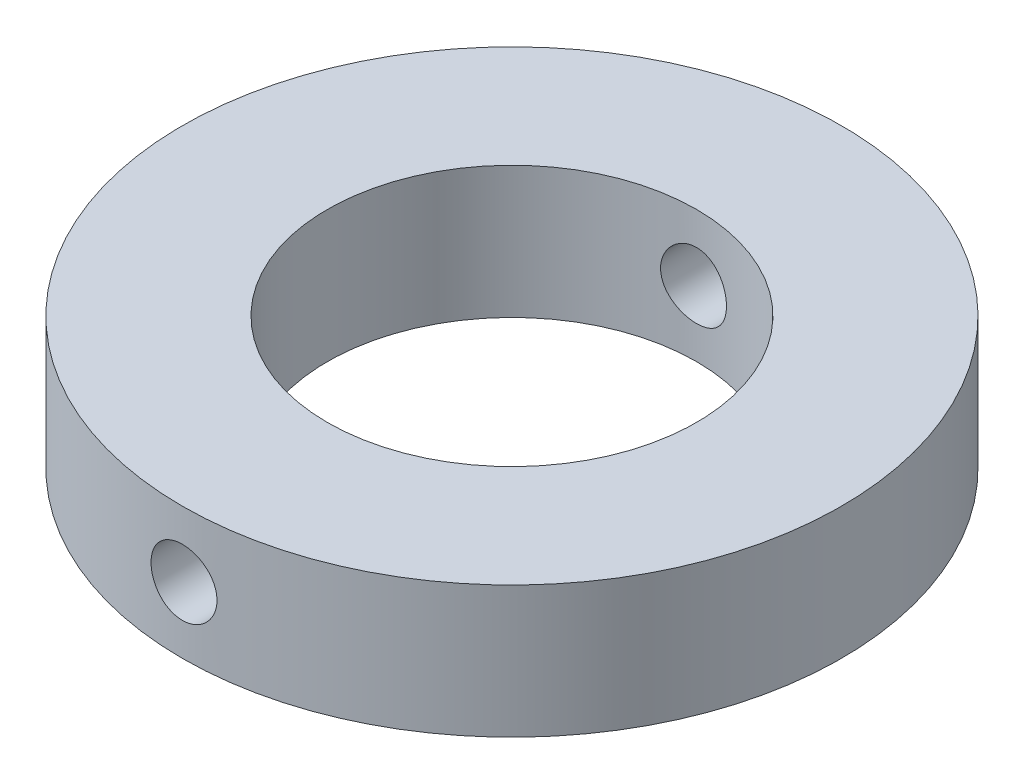
ISO-10303-21;
HEADER;
FILE_DESCRIPTION(('STEP AP214'),'2;1');
FILE_NAME('part.step','',(''),(''),'','','');
FILE_SCHEMA(('AUTOMOTIVE_DESIGN { 1 0 10303 214 1 1 1 1 }'));
ENDSEC;
DATA;
#1=APPLICATION_CONTEXT('core data for automotive mechanical design processes');
#2=APPLICATION_PROTOCOL_DEFINITION('international standard','automotive_design',2000,#1);
#3=PRODUCT_CONTEXT('',#1,'mechanical');
#4=PRODUCT('Part','Part','',(#3));
#5=PRODUCT_RELATED_PRODUCT_CATEGORY('part','',(#4));
#6=PRODUCT_DEFINITION_FORMATION('','',#4);
#7=PRODUCT_DEFINITION_CONTEXT('part definition',#1,'design');
#8=PRODUCT_DEFINITION('design','',#6,#7);
#9=PRODUCT_DEFINITION_SHAPE('','',#8);
#10=(LENGTH_UNIT() NAMED_UNIT(*) SI_UNIT(.MILLI.,.METRE.));
#11=(NAMED_UNIT(*) PLANE_ANGLE_UNIT() SI_UNIT($,.RADIAN.));
#12=(NAMED_UNIT(*) SI_UNIT($,.STERADIAN.) SOLID_ANGLE_UNIT());
#13=UNCERTAINTY_MEASURE_WITH_UNIT(LENGTH_MEASURE(1.E-05),#10,'distance_accuracy_value','');
#14=(GEOMETRIC_REPRESENTATION_CONTEXT(3) GLOBAL_UNCERTAINTY_ASSIGNED_CONTEXT((#13)) GLOBAL_UNIT_ASSIGNED_CONTEXT((#10,
#11,#12)) REPRESENTATION_CONTEXT('',''));
#15=CARTESIAN_POINT('',(0.,0.,0.));
#16=DIRECTION('',(0.,0.,1.));
#17=DIRECTION('',(1.,0.,0.));
#18=AXIS2_PLACEMENT_3D('',#15,#16,#17);
#19=CARTESIAN_POINT('',(0.,5.,0.));
#20=DIRECTION('',(0.,1.,0.));
#21=DIRECTION('',(0.,0.,1.));
#22=AXIS2_PLACEMENT_3D('',#19,#20,#21);
#23=PLANE('',#22);
#24=CARTESIAN_POINT('',(0.,5.,0.));
#25=DIRECTION('',(0.,1.,0.));
#26=DIRECTION('',(0.,0.,1.));
#27=AXIS2_PLACEMENT_3D('',#24,#25,#26);
#28=CIRCLE('',#27,25.);
#29=CARTESIAN_POINT('',(0.,5.,25.));
#30=VERTEX_POINT('',#29);
#31=EDGE_CURVE('E10',#30,#30,#28,.T.);
#32=ORIENTED_EDGE('',*,*,#31,.T.);
#33=EDGE_LOOP('',(#32));
#34=FACE_BOUND('',#33,.T.);
#35=CARTESIAN_POINT('',(0.,5.,0.));
#36=DIRECTION('',(0.,1.,0.));
#37=DIRECTION('',(0.,0.,1.));
#38=AXIS2_PLACEMENT_3D('',#35,#36,#37);
#39=CIRCLE('',#38,14.);
#40=CARTESIAN_POINT('',(0.,5.,14.));
#41=VERTEX_POINT('',#40);
#42=EDGE_CURVE('E51',#41,#41,#39,.T.);
#43=ORIENTED_EDGE('',*,*,#42,.F.);
#44=EDGE_LOOP('',(#43));
#45=FACE_BOUND('',#44,.T.);
#46=ADVANCED_FACE('F32',(#34,#45),#23,.T.);
#47=CARTESIAN_POINT('',(0.,-5.,0.));
#48=DIRECTION('',(0.,1.,0.));
#49=DIRECTION('',(0.,0.,1.));
#50=AXIS2_PLACEMENT_3D('',#47,#48,#49);
#51=PLANE('',#50);
#52=CARTESIAN_POINT('',(0.,-5.,0.));
#53=DIRECTION('',(0.,1.,0.));
#54=DIRECTION('',(0.,0.,1.));
#55=AXIS2_PLACEMENT_3D('',#52,#53,#54);
#56=CIRCLE('',#55,25.);
#57=CARTESIAN_POINT('',(0.,-5.,25.));
#58=VERTEX_POINT('',#57);
#59=EDGE_CURVE('E46',#58,#58,#56,.T.);
#60=ORIENTED_EDGE('',*,*,#59,.F.);
#61=EDGE_LOOP('',(#60));
#62=FACE_BOUND('',#61,.T.);
#63=CARTESIAN_POINT('',(0.,-5.,0.));
#64=DIRECTION('',(0.,1.,0.));
#65=DIRECTION('',(0.,0.,1.));
#66=AXIS2_PLACEMENT_3D('',#63,#64,#65);
#67=CIRCLE('',#66,14.);
#68=CARTESIAN_POINT('',(0.,-5.,14.));
#69=VERTEX_POINT('',#68);
#70=EDGE_CURVE('E54',#69,#69,#67,.T.);
#71=ORIENTED_EDGE('',*,*,#70,.T.);
#72=EDGE_LOOP('',(#71));
#73=FACE_BOUND('',#72,.T.);
#74=ADVANCED_FACE('F90',(#62,#73),#51,.F.);
#75=CARTESIAN_POINT('',(0.,5.,0.));
#76=DIRECTION('',(0.,-1.,0.));
#77=DIRECTION('',(0.,0.,-1.));
#78=AXIS2_PLACEMENT_3D('',#75,#76,#77);
#79=CYLINDRICAL_SURFACE('',#78,25.);
#80=CARTESIAN_POINT('',(0.,2.5,-25.));
#81=CARTESIAN_POINT('',(-0.140050884478893,2.49999393524905,-24.9999983880192));
#82=CARTESIAN_POINT('',(-0.280194362919433,2.48819182775889,-24.9988106399051));
#83=CARTESIAN_POINT('',(-0.556595996242093,2.44128907427393,-24.9941866898684));
#84=CARTESIAN_POINT('',(-0.69284969792207,2.40616275993853,-24.9907480108506));
#85=CARTESIAN_POINT('',(-0.957429188633536,2.31364439850542,-24.9820103640768));
#86=CARTESIAN_POINT('',(-1.08575971153727,2.25626579870381,-24.9767125200177));
#87=CARTESIAN_POINT('',(-1.33094040240102,2.12089773017089,-24.9648489348577));
#88=CARTESIAN_POINT('',(-1.44779284694769,2.04291235999965,-24.9582834459533));
#89=CARTESIAN_POINT('',(-1.6671488766852,1.86824325584431,-24.9445936085331));
#90=CARTESIAN_POINT('',(-1.76960536208723,1.77150050149492,-24.9374675393466));
#91=CARTESIAN_POINT('',(-1.95685630357746,1.56218866434242,-24.9234739226566));
#92=CARTESIAN_POINT('',(-2.04164994270663,1.44961884989403,-24.9166063871229));
#93=CARTESIAN_POINT('',(-2.19133492610904,1.21155367079095,-24.9038897888196));
#94=CARTESIAN_POINT('',(-2.2561836636372,1.08603138976285,-24.8980429177726));
#95=CARTESIAN_POINT('',(-2.3638659618569,0.825811035237553,-24.8880509386631));
#96=CARTESIAN_POINT('',(-2.40670006647823,0.691113188540125,-24.8839057885556));
#97=CARTESIAN_POINT('',(-2.46899760400473,0.416845497834976,-24.8778021018244));
#98=CARTESIAN_POINT('',(-2.48853913250949,0.277293557869479,-24.8758362599524));
#99=CARTESIAN_POINT('',(-2.5039382128384,-0.00312215848945159,-24.8742910765131));
#100=CARTESIAN_POINT('',(-2.499796387177,-0.143985900305148,-24.8747116722186));
#101=CARTESIAN_POINT('',(-2.4680107006317,-0.422488274233296,-24.8778851724734));
#102=CARTESIAN_POINT('',(-2.44045211031138,-0.560136748321736,-24.8806296147663));
#103=CARTESIAN_POINT('',(-2.36274786037647,-0.828844908002736,-24.8881283571855));
#104=CARTESIAN_POINT('',(-2.31260189563937,-0.959904504562578,-24.8928826844623));
#105=CARTESIAN_POINT('',(-2.19105223470377,-1.21198396824722,-24.9038752363018));
#106=CARTESIAN_POINT('',(-2.11961070679995,-1.33298547372329,-24.9101160977039));
#107=CARTESIAN_POINT('',(-1.95752506838307,-1.56131303727971,-24.923376293322));
#108=CARTESIAN_POINT('',(-1.86688039584126,-1.66863869495441,-24.9303956503196));
#109=CARTESIAN_POINT('',(-1.66848528103017,-1.86706348497257,-24.9444596328247));
#110=CARTESIAN_POINT('',(-1.56066119712841,-1.95808900470201,-24.9515042333249));
#111=CARTESIAN_POINT('',(-1.33122370434278,-2.12075908227597,-24.964795726963));
#112=CARTESIAN_POINT('',(-1.209610279999,-2.19240361839119,-24.9710426192064));
#113=CARTESIAN_POINT('',(-0.955995264230912,-2.31427505077563,-24.9820368916774));
#114=CARTESIAN_POINT('',(-0.823991865974758,-2.36449821204515,-24.9867840103692));
#115=CARTESIAN_POINT('',(-0.55336804332483,-2.44204729177938,-24.9942411860352));
#116=CARTESIAN_POINT('',(-0.414747816941501,-2.46937389497656,-24.9969513039266));
#117=CARTESIAN_POINT('',(-0.135462747729759,-2.50026076933691,-25.0000212917078));
#118=CARTESIAN_POINT('',(0.00519075526373,-2.50392262063125,-25.0003912066934));
#119=CARTESIAN_POINT('',(0.285109483289249,-2.48764284237809,-24.9987660439199));
#120=CARTESIAN_POINT('',(0.424374727051175,-2.4677015317118,-24.9967709981117));
#121=CARTESIAN_POINT('',(0.697270517086686,-2.40486576144606,-24.9906465384799));
#122=CARTESIAN_POINT('',(0.830912122430047,-2.36201886380497,-24.986521547951));
#123=CARTESIAN_POINT('',(1.08911080345945,-2.25463706490682,-24.9765999715152));
#124=CARTESIAN_POINT('',(1.21366767539279,-2.19010167740151,-24.9708033481313));
#125=CARTESIAN_POINT('',(1.45062045043036,-2.04092290334022,-24.9581618832606));
#126=CARTESIAN_POINT('',(1.56297414937229,-1.95621277768546,-24.951313590086));
#127=CARTESIAN_POINT('',(1.77190405827969,-1.76918483064768,-24.937348321738));
#128=CARTESIAN_POINT('',(1.86847987212294,-1.66686656732421,-24.9302313398243));
#129=CARTESIAN_POINT('',(2.04346527471786,-1.4470835633525,-24.9165006035189));
#130=CARTESIAN_POINT('',(2.12180819669886,-1.32956560864345,-24.9098887534744));
#131=CARTESIAN_POINT('',(2.25764564685957,-1.08298159963329,-24.8979458115222));
#132=CARTESIAN_POINT('',(2.3151404601347,-0.95391570327901,-24.8926147021009));
#133=CARTESIAN_POINT('',(2.40753802171119,-0.688128151335515,-24.8838486908512));
#134=CARTESIAN_POINT('',(2.44248043702965,-0.551420399772198,-24.8804104612447));
#135=CARTESIAN_POINT('',(2.48891001782366,-0.27404200509807,-24.8758091320719));
#136=CARTESIAN_POINT('',(2.50039785599879,-0.133371475760815,-24.8746459672547));
#137=CARTESIAN_POINT('',(2.49958284617814,0.147276720891762,-24.8747278276891));
#138=CARTESIAN_POINT('',(2.48738472398278,0.287254707207038,-24.8759622521752));
#139=CARTESIAN_POINT('',(2.43976363240913,0.56316229292072,-24.8806775972386));
#140=CARTESIAN_POINT('',(2.4043406369054,0.699091887764949,-24.884158520343));
#141=CARTESIAN_POINT('',(2.31130421574376,0.963043372619642,-24.8929717065797));
#142=CARTESIAN_POINT('',(2.25369386085229,1.09106635407431,-24.898303713509));
#143=CARTESIAN_POINT('',(2.11792888727761,1.33564222917759,-24.910218795984));
#144=CARTESIAN_POINT('',(2.03977438363854,1.45219518705157,-24.9168018645238));
#145=CARTESIAN_POINT('',(1.86474639071333,1.67105918617984,-24.9305121802424));
#146=CARTESIAN_POINT('',(1.76779487222567,1.77330769091772,-24.9376416181688));
#147=CARTESIAN_POINT('',(1.55807924806277,1.96013058174914,-24.9516213682196));
#148=CARTESIAN_POINT('',(1.44531136027064,2.04470072839292,-24.9584716130744));
#149=CARTESIAN_POINT('',(1.20685358540322,2.19393363463655,-24.971139051729));
#150=CARTESIAN_POINT('',(1.08113187336691,2.25854572736296,-24.9769536006703));
#151=CARTESIAN_POINT('',(0.820645697751377,2.36565605705967,-24.9868657312474));
#152=CARTESIAN_POINT('',(0.685891624564024,2.40817922738387,-24.9909652477413));
#153=CARTESIAN_POINT('',(0.458645653514261,2.459301542712,-24.9959553443433));
#154=CARTESIAN_POINT('',(0.367606382111272,2.47454261074839,-24.9974650172958));
#155=CARTESIAN_POINT('',(0.184391452043282,2.4948938151544,-24.9994878737697));
#156=CARTESIAN_POINT('',(0.0922157980663944,2.50000399330465,-25.0000010614006));
#157=CARTESIAN_POINT('',(0.,2.5,-25.));
#158=B_SPLINE_CURVE_WITH_KNOTS('',3,(#80,#81,#82,#83,#84,#85,#86,#87,#88,#89,#90,#91,#92,#93,
#94,#95,#96,#97,#98,#99,#100,#101,#102,#103,#104,#105,#106,#107,#108,#109,#110,#111,#112,#113,
#114,#115,#116,#117,#118,#119,#120,#121,#122,#123,#124,#125,#126,#127,#128,#129,#130,#131,#132,
#133,#134,#135,#136,#137,#138,#139,#140,#141,#142,#143,#144,#145,#146,#147,#148,#149,#150,#151,
#152,#153,#154,#155,#156,#157),.UNSPECIFIED.,.T.,.F.,(4,2,2,2,2,2,2,2,2,2,2,2,2,2,2,2,2,2,2,2,2,
2,2,2,2,2,2,2,2,2,2,2,2,2,2,2,2,2,4),(0.,0.419815915671184,0.840094607088716,1.26011971433051,
1.68006134395696,2.10134642155736,2.52265098051765,2.94484938680554,3.3670373610626,
3.78780580112991,4.20856318139441,4.62779493602776,5.04703235404084,5.46701903432236,
5.88701800827813,6.30886835490516,6.73071917449429,7.15264351733954,7.57455524188599,
7.99465471519394,8.41474851297859,8.83397338235762,9.25320765123667,9.67384851871746,
10.0944999452557,10.516666090215,10.9388264618844,11.3602422648251,11.7816459809896,
12.2011907323489,12.620735955651,13.04022313407,13.459707963474,13.8809729356913,
14.3023388159239,14.7247657756561,15.1467148698824,15.4231416808087,15.6995673517257),.UNSPECIFIED.);
#159=CARTESIAN_POINT('',(0.,2.5,-25.));
#160=VERTEX_POINT('',#159);
#161=EDGE_CURVE('E79',#160,#160,#158,.T.);
#162=ORIENTED_EDGE('',*,*,#161,.T.);
#163=EDGE_LOOP('',(#162));
#164=FACE_BOUND('',#163,.T.);
#165=CARTESIAN_POINT('',(2.5,0.,24.8746859276655));
#166=CARTESIAN_POINT('',(2.49999393348378,-0.140048910434006,24.8746875699226));
#167=CARTESIAN_POINT('',(2.48819214745619,-0.280190421029599,24.8758814248555));
#168=CARTESIAN_POINT('',(2.4412907869089,-0.556587965733839,24.880527188953));
#169=CARTESIAN_POINT('',(2.40616553721609,-0.692839545093725,24.8839815865305));
#170=CARTESIAN_POINT('',(2.31365029017232,-0.957414548044763,24.8927533261847));
#171=CARTESIAN_POINT('',(2.25627379073475,-1.0857427234786,24.8980695386697));
#172=CARTESIAN_POINT('',(2.12091066847775,-1.33091948072937,24.9099645142955));
#173=CARTESIAN_POINT('',(2.04292813906481,-1.44777033620929,24.9165430266082));
#174=CARTESIAN_POINT('',(1.86826190499676,-1.66712815914375,24.9302481677475));
#175=CARTESIAN_POINT('',(1.77151854527065,-1.76958752375946,24.9373765001317));
#176=CARTESIAN_POINT('',(1.56220428829891,-1.95684402250892,24.951362630893));
#177=CARTESIAN_POINT('',(1.44963266726642,-2.04164034851578,24.9582204168803));
#178=CARTESIAN_POINT('',(1.21156590412747,-2.19132814251788,24.9709095788901));
#179=CARTESIAN_POINT('',(1.08604415632392,-2.25617749698416,24.9767387723662));
#180=CARTESIAN_POINT('',(0.825824960718776,-2.36386108287171,24.9866954218943));
#181=CARTESIAN_POINT('',(0.691127736670547,-2.40669585092367,24.9908229194266));
#182=CARTESIAN_POINT('',(0.416861956857374,-2.46899477338312,24.9968991642756));
#183=CARTESIAN_POINT('',(0.277311317578954,-2.48853708187486,24.9988551960704));
#184=CARTESIAN_POINT('',(-0.00310185172235758,-2.50393817283429,25.0003928899673));
#185=CARTESIAN_POINT('',(-0.143964347636153,-2.49979756936568,24.9999746136318));
#186=CARTESIAN_POINT('',(-0.4224721101614,-2.46801381837461,24.9968167827796));
#187=CARTESIAN_POINT('',(-0.560127074837447,-2.44045471109027,24.9940855287928));
#188=CARTESIAN_POINT('',(-0.828847948761332,-2.36274717763345,24.9866182316233));
#189=CARTESIAN_POINT('',(-0.95991377239432,-2.31259845803107,24.9818821623988));
#190=CARTESIAN_POINT('',(-1.21200078669896,-2.1910430918639,24.9709234370979));
#191=CARTESIAN_POINT('',(-1.33300392745412,-2.11959925617461,24.9646981841439));
#192=CARTESIAN_POINT('',(-1.56133378293548,-1.95750869165908,24.9514596129852));
#193=CARTESIAN_POINT('',(-1.66866009640207,-1.86686139963704,24.9444462716703));
#194=CARTESIAN_POINT('',(-1.86708192955672,-1.66846442621589,24.9303823366963));
#195=CARTESIAN_POINT('',(-1.95810436547586,-1.56064163814606,24.9233317143257));
#196=CARTESIAN_POINT('',(-2.12076883839479,-1.33120783697306,24.9100184982056));
#197=CARTESIAN_POINT('',(-2.19241084728222,-1.20959680386964,24.9037559055991));
#198=CARTESIAN_POINT('',(-2.31428046143307,-0.955982437000525,24.8927272378537));
#199=CARTESIAN_POINT('',(-2.3645035514324,-0.82397691894278,24.8879614783139));
#200=CARTESIAN_POINT('',(-2.44205183909397,-0.553348488463279,24.8804725467734));
#201=CARTESIAN_POINT('',(-2.46937773435758,-0.414725777781389,24.8777493125442));
#202=CARTESIAN_POINT('',(-2.5002619384799,-0.135439551176231,24.8746645131854));
#203=CARTESIAN_POINT('',(-2.50392249161803,0.00521255066208328,24.8742927886901));
#204=CARTESIAN_POINT('',(-2.48764061717841,0.285128164557158,24.8759262838693));
#205=CARTESIAN_POINT('',(-2.46769850852438,0.424391695350918,24.8779314714265));
#206=CARTESIAN_POINT('',(-2.4048629362688,0.697278955695853,24.88408361056));
#207=CARTESIAN_POINT('',(-2.36201781797227,0.830913927736646,24.8882260500336));
#208=CARTESIAN_POINT('',(-2.25464179918985,1.08910012932576,24.8981822759699));
#209=CARTESIAN_POINT('',(-2.19011040195897,1.21365115071795,24.9039961007167));
#210=CARTESIAN_POINT('',(-2.04093750355804,1.45059993507194,24.9166646088928));
#211=CARTESIAN_POINT('',(-1.95622824960173,1.56295485491563,24.9235227703668));
#212=CARTESIAN_POINT('',(-1.76920133362794,1.77188763318516,24.9374958156297));
#213=CARTESIAN_POINT('',(-1.66688323562034,1.86846510085019,24.9446107057716));
#214=CARTESIAN_POINT('',(-1.44709951056619,2.04345408349523,24.9583261962325));
#215=CARTESIAN_POINT('',(-1.32958063992363,2.12179889896555,24.9649248513869));
#216=CARTESIAN_POINT('',(-1.08299429354283,2.25763967126603,24.9768360526658));
#217=CARTESIAN_POINT('',(-0.953926976074065,2.31513591376776,24.9821486164123));
#218=CARTESIAN_POINT('',(-0.688140316082038,2.40753441913834,24.9908802603501));
#219=CARTESIAN_POINT('',(-0.551435094124899,2.44247696831303,24.9943027151412));
#220=CARTESIAN_POINT('',(-0.274062034959199,2.48890767394961,24.9988823653412));
#221=CARTESIAN_POINT('',(-0.133394309230545,2.50039648958509,25.0000396244141));
#222=CARTESIAN_POINT('',(0.147255560189364,2.49958433390014,24.9999584578317));
#223=CARTESIAN_POINT('',(0.287238018061318,2.48738690790836,24.9987304594167));
#224=CARTESIAN_POINT('',(0.563154720890905,2.43976563585756,24.9940373394398));
#225=CARTESIAN_POINT('',(0.699088962670912,2.40434177156758,24.9905722161218));
#226=CARTESIAN_POINT('',(0.963049771919356,2.31130185651767,24.981793095349));
#227=CARTESIAN_POINT('',(1.09107741519382,2.25368883266461,24.9764793500812));
#228=CARTESIAN_POINT('',(1.33566150038699,2.11791707770755,24.9645953104074));
#229=CARTESIAN_POINT('',(1.4522180094214,2.0397584668222,24.9580250233539));
#230=CARTESIAN_POINT('',(1.67108181106734,1.86472595244063,24.9443296167264));
#231=CARTESIAN_POINT('',(1.77332731554835,1.767774959388,24.9372022865175));
#232=CARTESIAN_POINT('',(1.96014439848285,1.55806162113638,24.9232147692415));
#233=CARTESIAN_POINT('',(2.04471172961962,1.44529548707731,24.9163546466944));
#234=CARTESIAN_POINT('',(2.19394160106013,1.20683914520022,24.903659585265));
#235=CARTESIAN_POINT('',(2.25855296998709,1.08111679668987,24.8978272981327));
#236=CARTESIAN_POINT('',(2.36566177024692,0.820629271884418,24.8878798690615));
#237=CARTESIAN_POINT('',(2.40818414472464,0.685874490185715,24.883762791334));
#238=CARTESIAN_POINT('',(2.45930422083382,0.458630647752214,24.8787501884536));
#239=CARTESIAN_POINT('',(2.47454428099556,0.36759437173393,24.8772332983924));
#240=CARTESIAN_POINT('',(2.49489414651278,0.184385442393616,24.8752006294416));
#241=CARTESIAN_POINT('',(2.50000399439316,0.0922127938435166,24.8746848463496));
#242=CARTESIAN_POINT('',(2.5,0.,24.8746859276655));
#243=B_SPLINE_CURVE_WITH_KNOTS('',3,(#165,#166,#167,#168,#169,#170,#171,#172,#173,#174,#175,
#176,#177,#178,#179,#180,#181,#182,#183,#184,#185,#186,#187,#188,#189,#190,#191,#192,#193,#194,
#195,#196,#197,#198,#199,#200,#201,#202,#203,#204,#205,#206,#207,#208,#209,#210,#211,#212,#213,
#214,#215,#216,#217,#218,#219,#220,#221,#222,#223,#224,#225,#226,#227,#228,#229,#230,#231,#232,
#233,#234,#235,#236,#237,#238,#239,#240,#241,#242),.UNSPECIFIED.,.T.,.F.,(4,2,2,2,2,2,2,2,2,2,2,
2,2,2,2,2,2,2,2,2,2,2,2,2,2,2,2,2,2,2,2,2,2,2,2,2,2,2,4),(0.,0.419809986091154,
0.840082879554424,1.26010122749368,1.68003620105329,2.10132903824813,2.52264114638132,
2.94483674928229,3.36702206019487,3.78778677246124,4.20854057495581,4.62779079546654,
5.04704646202435,5.46703863666033,5.88704313046322,6.30888562712503,6.73072873568907,
7.15266072794834,7.57457986487582,7.99467490769413,8.41476427417176,8.83397036761317,
9.25318606402618,9.67382974529295,10.0944838430801,10.516653420453,10.9388172129501,
11.360224817359,11.7816205778287,12.2011783367121,12.6207364249165,13.0402372998811,
13.45973572027,13.8809928759497,14.3023511258631,14.7247810267619,15.14673287235,
15.4231506901512,15.6995673475954),.UNSPECIFIED.);
#244=CARTESIAN_POINT('',(2.5,0.,24.8746859276655));
#245=VERTEX_POINT('',#244);
#246=EDGE_CURVE('E74',#245,#245,#243,.T.);
#247=ORIENTED_EDGE('',*,*,#246,.T.);
#248=EDGE_LOOP('',(#247));
#249=FACE_BOUND('',#248,.T.);
#250=ORIENTED_EDGE('',*,*,#31,.F.);
#251=EDGE_LOOP('',(#250));
#252=FACE_BOUND('',#251,.T.);
#253=ORIENTED_EDGE('',*,*,#59,.T.);
#254=EDGE_LOOP('',(#253));
#255=FACE_BOUND('',#254,.T.);
#256=ADVANCED_FACE('F34',(#164,#249,#252,#255),#79,.T.);
#257=CARTESIAN_POINT('',(0.,5.,0.));
#258=DIRECTION('',(0.,-1.,0.));
#259=DIRECTION('',(0.,0.,-1.));
#260=AXIS2_PLACEMENT_3D('',#257,#258,#259);
#261=CYLINDRICAL_SURFACE('',#260,14.);
#262=CARTESIAN_POINT('',(0.,2.5,-14.));
#263=CARTESIAN_POINT('',(-0.139239584884692,2.49999455739785,-13.9999975279519));
#264=CARTESIAN_POINT('',(-0.278551398798767,2.48832809754965,-13.9979012185717));
#265=CARTESIAN_POINT('',(-0.55325746155145,2.44199583361771,-13.9897405917584));
#266=CARTESIAN_POINT('',(-0.688648164109867,2.40730984916213,-13.9836727927304));
#267=CARTESIAN_POINT('',(-0.951498716003345,2.31602776676197,-13.9682487550673));
#268=CARTESIAN_POINT('',(-1.07896532023462,2.2594506356316,-13.9588953637627));
#269=CARTESIAN_POINT('',(-1.32258294398845,2.12604431178294,-13.9379246329878));
#270=CARTESIAN_POINT('',(-1.43873504418376,2.04921705580053,-13.9263075100501));
#271=CARTESIAN_POINT('',(-1.65770744324836,1.87660078698247,-13.9019523246795));
#272=CARTESIAN_POINT('',(-1.76038642030698,1.7806338701291,-13.8892044205267));
#273=CARTESIAN_POINT('',(-1.94827611327337,1.57284525046249,-13.8640984861177));
#274=CARTESIAN_POINT('',(-2.03348564380397,1.46102247263114,-13.851740482366));
#275=CARTESIAN_POINT('',(-2.18459604528548,1.22370988288653,-13.828718102426));
#276=CARTESIAN_POINT('',(-2.25035491937039,1.09812831307603,-13.8180664295287));
#277=CARTESIAN_POINT('',(-2.35978878168924,0.8374788413355,-13.799800524336));
#278=CARTESIAN_POINT('',(-2.40346549014524,0.702411679276169,-13.7921860554493));
#279=CARTESIAN_POINT('',(-2.46704527057167,0.428131178585148,-13.7809553111512));
#280=CARTESIAN_POINT('',(-2.48719373563911,0.288976444858396,-13.7772977959189));
#281=CARTESIAN_POINT('',(-2.50390640595674,0.00921707799266534,-13.7742705702387));
#282=CARTESIAN_POINT('',(-2.50047252779549,-0.131387436392096,-13.7749005113397));
#283=CARTESIAN_POINT('',(-2.47031736473549,-0.408288897436546,-13.78033942777));
#284=CARTESIAN_POINT('',(-2.44387361595034,-0.544617190254226,-13.7850985960022));
#285=CARTESIAN_POINT('',(-2.3688857538611,-0.810870636498552,-13.7981816164894));
#286=CARTESIAN_POINT('',(-2.3203407810603,-0.940795540685383,-13.8065056073765));
#287=CARTESIAN_POINT('',(-2.2022526779638,-1.19137447886924,-13.8258332062344));
#288=CARTESIAN_POINT('',(-2.13259607876041,-1.31197388160888,-13.836851230427));
#289=CARTESIAN_POINT('',(-1.97434240206301,-1.53987750221547,-13.8603157063341));
#290=CARTESIAN_POINT('',(-1.88574357580469,-1.64718049109919,-13.8727622898853));
#291=CARTESIAN_POINT('',(-1.69061708906587,-1.84705021778733,-13.8978993100277));
#292=CARTESIAN_POINT('',(-1.58385171151662,-1.93938491797957,-13.9105906924877));
#293=CARTESIAN_POINT('',(-1.35622200140276,-2.10486613290801,-13.934623736005));
#294=CARTESIAN_POINT('',(-1.23535755129116,-2.17801248765032,-13.9459653858077));
#295=CARTESIAN_POINT('',(-0.98272912541029,-2.30306902369628,-13.9660408385903));
#296=CARTESIAN_POINT('',(-0.850953766692502,-2.3549566822979,-13.9747718731006));
#297=CARTESIAN_POINT('',(-0.580367401035939,-2.43579688219198,-13.9886206199705));
#298=CARTESIAN_POINT('',(-0.441557072364819,-2.46475163007287,-13.9937386799627));
#299=CARTESIAN_POINT('',(-0.162838985381711,-2.49858484604504,-13.999737506353));
#300=CARTESIAN_POINT('',(-0.0229710170574319,-2.50378150854804,-14.0006742692249));
#301=CARTESIAN_POINT('',(0.255635962261019,-2.49080226023669,-13.9983590537919));
#302=CARTESIAN_POINT('',(0.39437502309646,-2.47262738697212,-13.9951072614327));
#303=CARTESIAN_POINT('',(0.66578830988004,-2.4136856015097,-13.9848150834562));
#304=CARTESIAN_POINT('',(0.798498270193176,-2.37307816078221,-13.9778014506051));
#305=CARTESIAN_POINT('',(1.0552266666947,-2.27059536981458,-13.960768732277));
#306=CARTESIAN_POINT('',(1.17924455600831,-2.2087186828312,-13.9507494579045));
#307=CARTESIAN_POINT('',(1.4164370995142,-2.06473877708765,-13.9286773386827));
#308=CARTESIAN_POINT('',(1.52949072853056,-1.9824392084602,-13.9166051337771));
#309=CARTESIAN_POINT('',(1.74029662989026,-1.80021734893848,-13.8918196803142));
#310=CARTESIAN_POINT('',(1.8380476135904,-1.70029357540657,-13.8791063778887));
#311=CARTESIAN_POINT('',(2.01666949257316,-1.48422503075245,-13.8542878912599));
#312=CARTESIAN_POINT('',(2.09732417121667,-1.36790029913286,-13.8421918152179));
#313=CARTESIAN_POINT('',(2.23794827077399,-1.12316631055121,-13.8201546664427));
#314=CARTESIAN_POINT('',(2.29791841370413,-0.994757475597178,-13.8102135184939));
#315=CARTESIAN_POINT('',(2.39515706197427,-0.730073825159321,-13.7936819036385));
#316=CARTESIAN_POINT('',(2.43252842924635,-0.593837789181893,-13.7870762776017));
#317=CARTESIAN_POINT('',(2.48382895891452,-0.316892704853755,-13.7779274424092));
#318=CARTESIAN_POINT('',(2.49776049425864,-0.176184110755291,-13.7753838220348));
#319=CARTESIAN_POINT('',(2.50171229780526,0.103549208901465,-13.7746664843416));
#320=CARTESIAN_POINT('',(2.49207328035334,0.242569077141851,-13.7764304992774));
#321=CARTESIAN_POINT('',(2.44989946243099,0.516973818018075,-13.7839923104721));
#322=CARTESIAN_POINT('',(2.4173647696137,0.652358707742106,-13.7897900877646));
#323=CARTESIAN_POINT('',(2.3304611386535,0.91548987603338,-13.8047410588042));
#324=CARTESIAN_POINT('',(2.27612576514715,1.04324755178609,-13.8138890925692));
#325=CARTESIAN_POINT('',(2.14719934056736,1.28788843943675,-13.8345140264404));
#326=CARTESIAN_POINT('',(2.07260704454505,1.4047709823784,-13.8459910696717));
#327=CARTESIAN_POINT('',(1.90408567428783,1.62605704739002,-13.8701759776461));
#328=CARTESIAN_POINT('',(1.80990741155503,1.73026923174324,-13.882898459028));
#329=CARTESIAN_POINT('',(1.60540999726032,1.92152580596623,-13.9080282435319));
#330=CARTESIAN_POINT('',(1.49508713803928,2.00856624147728,-13.920435473485));
#331=CARTESIAN_POINT('',(1.26037074660264,2.16365776778883,-13.9436534678806));
#332=CARTESIAN_POINT('',(1.13587103767058,2.23155025939159,-13.9544505684285));
#333=CARTESIAN_POINT('',(0.87708484019048,2.34534920329274,-13.9730987112511));
#334=CARTESIAN_POINT('',(0.742807935956544,2.39127686149759,-13.9809525934581));
#335=CARTESIAN_POINT('',(0.50673175549175,2.45023061339608,-13.9911779735748));
#336=CARTESIAN_POINT('',(0.406334867671672,2.46886313693672,-13.9944679971863));
#337=CARTESIAN_POINT('',(0.203971552038941,2.49374969040371,-13.9988798925243));
#338=CARTESIAN_POINT('',(0.102005158109662,2.50000398718147,-14.0000018109911));
#339=CARTESIAN_POINT('',(0.,2.5,-14.));
#340=B_SPLINE_CURVE_WITH_KNOTS('',3,(#262,#263,#264,#265,#266,#267,#268,#269,#270,#271,#272,
#273,#274,#275,#276,#277,#278,#279,#280,#281,#282,#283,#284,#285,#286,#287,#288,#289,#290,#291,
#292,#293,#294,#295,#296,#297,#298,#299,#300,#301,#302,#303,#304,#305,#306,#307,#308,#309,#310,
#311,#312,#313,#314,#315,#316,#317,#318,#319,#320,#321,#322,#323,#324,#325,#326,#327,#328,#329,
#330,#331,#332,#333,#334,#335,#336,#337,#338,#339),.UNSPECIFIED.,.T.,.F.,(4,2,2,2,2,2,2,2,2,2,2,
2,2,2,2,2,2,2,2,2,2,2,2,2,2,2,2,2,2,2,2,2,2,2,2,2,2,2,4),(0.,0.41734579674163,0.835057949374025,
1.25240899749004,1.66972014433903,2.09110796789027,2.5125243749628,2.93694536469338,
3.36133328652202,3.78125426758825,4.20114112116257,4.61603258426602,5.03094018350354,
5.44811857395103,5.86533549534551,6.28850377891475,6.71167559078141,7.13529458336167,
7.55887281066884,7.97676106621614,8.3946307707832,8.80956740145243,9.22453011509511,
9.64364840488131,10.062801969859,10.4869762077788,10.9111356379343,11.3333496148672,
11.7555208460958,12.1716257235315,12.5877286444974,13.0031933708605,13.4186836366131,
13.8398246877353,14.2610626074926,14.6856934454013,15.109913492521,15.4156623340469,
15.7214045841282),.UNSPECIFIED.);
#341=CARTESIAN_POINT('',(0.,2.5,-14.));
#342=VERTEX_POINT('',#341);
#343=EDGE_CURVE('E37',#342,#342,#340,.T.);
#344=ORIENTED_EDGE('',*,*,#343,.F.);
#345=EDGE_LOOP('',(#344));
#346=FACE_BOUND('',#345,.T.);
#347=CARTESIAN_POINT('',(2.5,0.,13.7749773139559));
#348=CARTESIAN_POINT('',(2.49999454116291,-0.139219633012448,13.7749799387038));
#349=CARTESIAN_POINT('',(2.48833131153942,-0.278511541870328,13.7771107908789));
#350=CARTESIAN_POINT('',(2.44201304135071,-0.553176265413883,13.7853946199968));
#351=CARTESIAN_POINT('',(2.40733774573406,-0.688545517756535,13.7915511402329));
#352=CARTESIAN_POINT('',(2.31608691728922,-0.951350660636084,13.8071672988197));
#353=CARTESIAN_POINT('',(2.25953085486463,-1.07879348772988,13.8166239998033));
#354=CARTESIAN_POINT('',(2.12617418313794,-1.3223710878122,13.8377715156682));
#355=CARTESIAN_POINT('',(2.04937546105772,-1.4385069135703,13.8494621222548));
#356=CARTESIAN_POINT('',(1.87678833540928,-1.65749692777843,13.873907770039));
#357=CARTESIAN_POINT('',(1.78081562712206,-1.76020481706534,13.8866723857643));
#358=CARTESIAN_POINT('',(1.57300318552243,-1.94815052892556,13.9117430255489));
#359=CARTESIAN_POINT('',(1.46116245702623,-2.03338725495156,13.9240490207841));
#360=CARTESIAN_POINT('',(1.22383338523177,-2.18452671026704,13.9469179106052));
#361=CARTESIAN_POINT('',(1.09825637183169,-2.2502922711374,13.9574682193538));
#362=CARTESIAN_POINT('',(0.837616772802055,-2.35973974268553,13.9755301011882));
#363=CARTESIAN_POINT('',(0.702554895423184,-2.40342330027072,13.9830419008821));
#364=CARTESIAN_POINT('',(0.428293673644162,-2.46701649004522,13.9941127759412));
#365=CARTESIAN_POINT('',(0.289153116844088,-2.48717241704352,13.997712773247));
#366=CARTESIAN_POINT('',(0.00942173772767329,-2.50390492724634,14.0006952718093));
#367=CARTESIAN_POINT('',(-0.131168971263458,-2.50048333923335,14.0000781001693));
#368=CARTESIAN_POINT('',(-0.408122988432861,-2.47034824580327,13.9947279617152));
#369=CARTESIAN_POINT('',(-0.544516181052064,-2.44389987640144,13.9900418473477));
#370=CARTESIAN_POINT('',(-0.810897015102343,-2.36888051208921,13.9771327520065));
#371=CARTESIAN_POINT('',(-0.940884439369611,-2.32030876773883,13.9689096512162));
#372=CARTESIAN_POINT('',(-1.19154151829012,-2.2021640140837,13.9497715520927));
#373=CARTESIAN_POINT('',(-1.31215944836134,-2.13248357791783,13.9388428375475));
#374=CARTESIAN_POINT('',(-1.54009014093527,-1.97417836106118,13.9155046200703));
#375=CARTESIAN_POINT('',(-1.64740167052528,-1.88555182697739,13.9030949801311));
#376=CARTESIAN_POINT('',(-1.84724240926311,-1.6904048880118,13.8779680889456));
#377=CARTESIAN_POINT('',(-1.939545099914,-1.58365261216223,13.8652489602259));
#378=CARTESIAN_POINT('',(-2.10496786240999,-1.35606079182697,13.8411025662894));
#379=CARTESIAN_POINT('',(-2.17808770266066,-1.23522107728917,13.8296753166704));
#380=CARTESIAN_POINT('',(-2.30312479829604,-0.982600952102693,13.8094045266784));
#381=CARTESIAN_POINT('',(-2.3550116418329,-0.850805171753708,13.8005646973667));
#382=CARTESIAN_POINT('',(-2.43584403060096,-0.580174187588617,13.7865283348087));
#383=CARTESIAN_POINT('',(-2.46479191631386,-0.441339703475874,13.7813314298779));
#384=CARTESIAN_POINT('',(-2.49859916205466,-0.162607904558829,13.7752421770154));
#385=CARTESIAN_POINT('',(-2.50378283673313,-0.0227511530500787,13.7742918793935));
#386=CARTESIAN_POINT('',(-2.49078161816558,0.255830337015873,13.776648684601));
#387=CARTESIAN_POINT('',(-2.47259776776007,0.394555125812008,13.7799555974406));
#388=CARTESIAN_POINT('',(-2.41365525865841,0.665884582268423,13.7904004323731));
#389=CARTESIAN_POINT('',(-2.37306442666378,0.798526902606946,13.7975098617234));
#390=CARTESIAN_POINT('',(-2.27063733511702,1.05512731220402,13.8147344144981));
#391=CARTESIAN_POINT('',(-2.20879963822381,1.17908481325517,13.824849741264));
#392=CARTESIAN_POINT('',(-2.06487935022985,1.41623212646771,13.847079502443));
#393=CARTESIAN_POINT('',(-1.98259057596104,1.52929490846936,13.8592138527616));
#394=CARTESIAN_POINT('',(-1.80038422344424,1.74012425516573,13.8840574336727));
#395=CARTESIAN_POINT('',(-1.70046521371052,1.83788957656711,13.896766710884));
#396=CARTESIAN_POINT('',(-1.48439134339207,2.01654831471628,13.9215130679047));
#397=CARTESIAN_POINT('',(-1.36805548621629,2.09722441961517,13.9335402120035));
#398=CARTESIAN_POINT('',(-1.12329296566844,2.23788606242208,13.9554035273845));
#399=CARTESIAN_POINT('',(-0.994866736508674,2.29787234302161,13.9652397773074));
#400=CARTESIAN_POINT('',(-0.730189348324157,2.3951205185574,13.9815700956849));
#401=CARTESIAN_POINT('',(-0.593979571421842,2.4324922165785,13.9880802890981));
#402=CARTESIAN_POINT('',(-0.31709034328691,2.48380228348004,13.9970934930076));
#403=CARTESIAN_POINT('',(-0.176411318075571,2.49774287909056,13.9995968842815));
#404=CARTESIAN_POINT('',(0.103333169371392,2.50172342694688,14.0003078168069));
#405=CARTESIAN_POINT('',(0.242393904292869,2.49209265113608,13.9985745411226));
#406=CARTESIAN_POINT('',(0.516882556055425,2.44992103326124,13.9911289095657));
#407=CARTESIAN_POINT('',(0.65231050098277,2.41738036837394,13.9854165844658));
#408=CARTESIAN_POINT('',(0.915536497496654,2.33044606302897,13.9706535216891));
#409=CARTESIAN_POINT('',(1.04334539246558,2.27608437427227,13.9616076667541));
#410=CARTESIAN_POINT('',(1.28807790386464,2.14708930688954,13.9411603934573));
#411=CARTESIAN_POINT('',(1.40500088290236,2.07245474224663,13.9297588372901));
#412=CARTESIAN_POINT('',(1.62629147773911,1.90388401128727,13.9056730650892));
#413=CARTESIAN_POINT('',(1.73047516435831,1.80970848117299,13.892974041367));
#414=CARTESIAN_POINT('',(1.92167550896122,1.60522862803593,13.8678219751628));
#415=CARTESIAN_POINT('',(2.00868813488379,1.49492052736975,13.8553689910715));
#416=CARTESIAN_POINT('',(2.1637462241578,1.26021883881617,13.8320070537405));
#417=CARTESIAN_POINT('',(2.23162894316816,1.13571634738038,13.8211117157455));
#418=CARTESIAN_POINT('',(2.34540886935923,0.876924932344392,13.8022610834653));
#419=CARTESIAN_POINT('',(2.39132736832844,0.742645632362284,13.7943029436204));
#420=CARTESIAN_POINT('',(2.45025798781186,0.506593264786613,13.7839341813702));
#421=CARTESIAN_POINT('',(2.46888019081668,0.406224134088536,13.7805947327216));
#422=CARTESIAN_POINT('',(2.49375305438023,0.20391623803211,13.7761153629215));
#423=CARTESIAN_POINT('',(2.50000399856396,0.101977508712572,13.7749753913445));
#424=CARTESIAN_POINT('',(2.5,0.,13.7749773139559));
#425=B_SPLINE_CURVE_WITH_KNOTS('',3,(#347,#348,#349,#350,#351,#352,#353,#354,#355,#356,#357,
#358,#359,#360,#361,#362,#363,#364,#365,#366,#367,#368,#369,#370,#371,#372,#373,#374,#375,#376,
#377,#378,#379,#380,#381,#382,#383,#384,#385,#386,#387,#388,#389,#390,#391,#392,#393,#394,#395,
#396,#397,#398,#399,#400,#401,#402,#403,#404,#405,#406,#407,#408,#409,#410,#411,#412,#413,#414,
#415,#416,#417,#418,#419,#420,#421,#422,#423,#424),.UNSPECIFIED.,.T.,.F.,(4,2,2,2,2,2,2,2,2,2,2,
2,2,2,2,2,2,2,2,2,2,2,2,2,2,2,2,2,2,2,2,2,2,2,2,2,2,2,4),(0.,0.417285836009318,
0.834939451951073,1.25222227420764,1.66946620696475,2.09093251520214,2.512425267948,
2.93682027279778,3.36118362098868,3.78106358503935,4.20091098159995,4.61598714610604,
5.03107737256277,5.44831662439174,5.86559450693788,6.28867984623349,6.71177029320068,
7.13546462585336,7.55911572303873,7.97696761802826,8.39480086586731,8.80954621973386,
9.22431963646754,9.64345757488935,10.0626295608599,10.4868484189542,10.9110520475065,
11.3331791121111,11.7552660584073,12.171490547398,12.5877118174953,13.0033258408441,
13.4189641839515,13.8400311188066,14.2611968100938,14.6858441972248,15.1100790990291,
15.4157453666601,15.7214046264678),.UNSPECIFIED.);
#426=CARTESIAN_POINT('',(2.5,0.,13.7749773139559));
#427=VERTEX_POINT('',#426);
#428=EDGE_CURVE('E56',#427,#427,#425,.T.);
#429=ORIENTED_EDGE('',*,*,#428,.F.);
#430=EDGE_LOOP('',(#429));
#431=FACE_BOUND('',#430,.T.);
#432=ORIENTED_EDGE('',*,*,#42,.T.);
#433=EDGE_LOOP('',(#432));
#434=FACE_BOUND('',#433,.T.);
#435=ORIENTED_EDGE('',*,*,#70,.F.);
#436=EDGE_LOOP('',(#435));
#437=FACE_BOUND('',#436,.T.);
#438=ADVANCED_FACE('F61',(#346,#431,#434,#437),#261,.F.);
#439=CARTESIAN_POINT('',(0.,0.,-35.));
#440=DIRECTION('',(0.,0.,1.));
#441=DIRECTION('',(1.,0.,0.));
#442=AXIS2_PLACEMENT_3D('',#439,#440,#441);
#443=CYLINDRICAL_SURFACE('',#442,2.5);
#444=ORIENTED_EDGE('',*,*,#428,.T.);
#445=EDGE_LOOP('',(#444));
#446=FACE_BOUND('',#445,.T.);
#447=ORIENTED_EDGE('',*,*,#246,.F.);
#448=EDGE_LOOP('',(#447));
#449=FACE_BOUND('',#448,.T.);
#450=ADVANCED_FACE('F67',(#446,#449),#443,.F.);
#451=ORIENTED_EDGE('',*,*,#343,.T.);
#452=EDGE_LOOP('',(#451));
#453=FACE_BOUND('',#452,.T.);
#454=ORIENTED_EDGE('',*,*,#161,.F.);
#455=EDGE_LOOP('',(#454));
#456=FACE_BOUND('',#455,.T.);
#457=ADVANCED_FACE('F64',(#453,#456),#443,.F.);
#458=CLOSED_SHELL('',(#46,#74,#256,#438,#450,#457));
#459=MANIFOLD_SOLID_BREP('B2',#458);
#460=ADVANCED_BREP_SHAPE_REPRESENTATION('',(#18,#459),#14);
#461=SHAPE_DEFINITION_REPRESENTATION(#9,#460);
ENDSEC;
END-ISO-10303-21;
